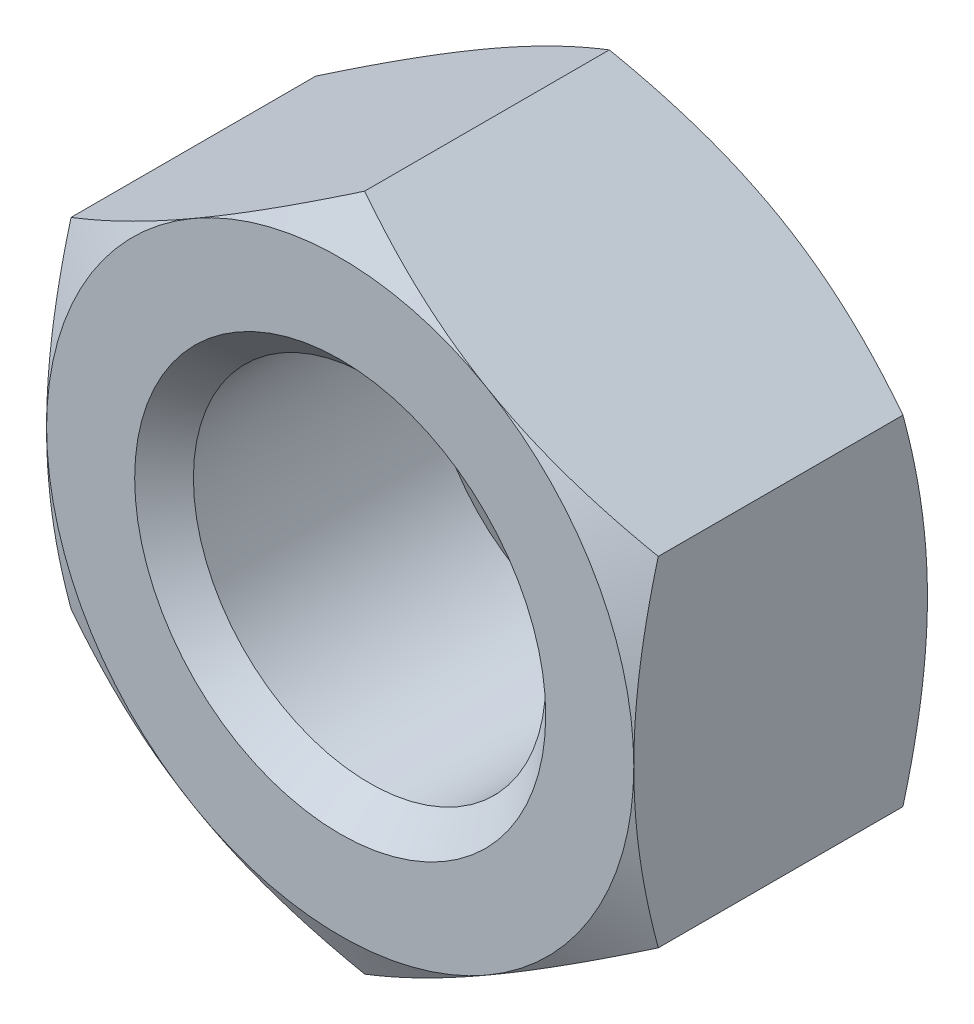
ISO-10303-21;
HEADER;
FILE_DESCRIPTION(('STEP AP214'),'2;1');
FILE_NAME('part.step','',(''),(''),'','','');
FILE_SCHEMA(('AUTOMOTIVE_DESIGN { 1 0 10303 214 1 1 1 1 }'));
ENDSEC;
DATA;
#1=APPLICATION_CONTEXT('core data for automotive mechanical design processes');
#2=APPLICATION_PROTOCOL_DEFINITION('international standard','automotive_design',2000,#1);
#3=PRODUCT_CONTEXT('',#1,'mechanical');
#4=PRODUCT('Part','Part','',(#3));
#5=PRODUCT_RELATED_PRODUCT_CATEGORY('part','',(#4));
#6=PRODUCT_DEFINITION_FORMATION('','',#4);
#7=PRODUCT_DEFINITION_CONTEXT('part definition',#1,'design');
#8=PRODUCT_DEFINITION('design','',#6,#7);
#9=PRODUCT_DEFINITION_SHAPE('','',#8);
#10=(LENGTH_UNIT() NAMED_UNIT(*) SI_UNIT(.MILLI.,.METRE.));
#11=(NAMED_UNIT(*) PLANE_ANGLE_UNIT() SI_UNIT($,.RADIAN.));
#12=(NAMED_UNIT(*) SI_UNIT($,.STERADIAN.) SOLID_ANGLE_UNIT());
#13=UNCERTAINTY_MEASURE_WITH_UNIT(LENGTH_MEASURE(1.E-05),#10,'distance_accuracy_value','');
#14=(GEOMETRIC_REPRESENTATION_CONTEXT(3) GLOBAL_UNCERTAINTY_ASSIGNED_CONTEXT((#13)) GLOBAL_UNIT_ASSIGNED_CONTEXT((#10,
#11,#12)) REPRESENTATION_CONTEXT('',''));
#15=CARTESIAN_POINT('',(0.,0.,0.));
#16=DIRECTION('',(0.,0.,1.));
#17=DIRECTION('',(1.,0.,0.));
#18=AXIS2_PLACEMENT_3D('',#15,#16,#17);
#19=CARTESIAN_POINT('',(0.,0.,5.));
#20=DIRECTION('',(0.,0.,1.));
#21=DIRECTION('',(1.,0.,0.));
#22=AXIS2_PLACEMENT_3D('',#19,#20,#21);
#23=PLANE('',#22);
#24=CARTESIAN_POINT('',(0.,0.,5.));
#25=DIRECTION('',(0.,0.,-1.));
#26=DIRECTION('',(-1.,0.,0.));
#27=AXIS2_PLACEMENT_3D('',#24,#25,#26);
#28=CIRCLE('',#27,3.5);
#29=CARTESIAN_POINT('',(-3.5,0.,5.));
#30=VERTEX_POINT('',#29);
#31=EDGE_CURVE('E160',#30,#30,#28,.T.);
#32=ORIENTED_EDGE('',*,*,#31,.T.);
#33=EDGE_LOOP('',(#32));
#34=FACE_BOUND('',#33,.T.);
#35=CARTESIAN_POINT('',(0.,0.,5.));
#36=DIRECTION('',(0.,0.,-1.));
#37=DIRECTION('',(-1.,0.,0.));
#38=AXIS2_PLACEMENT_3D('',#35,#36,#37);
#39=CIRCLE('',#38,5.);
#40=CARTESIAN_POINT('',(5.,0.,5.));
#41=VERTEX_POINT('',#40);
#42=CARTESIAN_POINT('',(2.5,-4.3301270189222,5.));
#43=VERTEX_POINT('',#42);
#44=EDGE_CURVE('E304',#41,#43,#39,.T.);
#45=ORIENTED_EDGE('',*,*,#44,.F.);
#46=CARTESIAN_POINT('',(2.5,4.33012701892219,5.));
#47=VERTEX_POINT('',#46);
#48=EDGE_CURVE('E306',#47,#41,#39,.T.);
#49=ORIENTED_EDGE('',*,*,#48,.F.);
#50=CARTESIAN_POINT('',(-2.5,4.33012701892219,5.));
#51=VERTEX_POINT('',#50);
#52=EDGE_CURVE('E312',#51,#47,#39,.T.);
#53=ORIENTED_EDGE('',*,*,#52,.F.);
#54=CARTESIAN_POINT('',(-5.,0.,5.));
#55=VERTEX_POINT('',#54);
#56=EDGE_CURVE('E314',#55,#51,#39,.T.);
#57=ORIENTED_EDGE('',*,*,#56,.F.);
#58=CARTESIAN_POINT('',(-2.5,-4.3301270189222,5.));
#59=VERTEX_POINT('',#58);
#60=EDGE_CURVE('E313',#59,#55,#39,.T.);
#61=ORIENTED_EDGE('',*,*,#60,.F.);
#62=EDGE_CURVE('E308',#43,#59,#39,.T.);
#63=ORIENTED_EDGE('',*,*,#62,.F.);
#64=EDGE_LOOP('',(#45,#49,#53,#57,#61,#63));
#65=FACE_BOUND('',#64,.T.);
#66=ADVANCED_FACE('F33',(#34,#65),#23,.T.);
#67=CARTESIAN_POINT('',(0.,0.,0.));
#68=DIRECTION('',(0.,0.,1.));
#69=DIRECTION('',(1.,0.,0.));
#70=AXIS2_PLACEMENT_3D('',#67,#68,#69);
#71=PLANE('',#70);
#72=CARTESIAN_POINT('',(0.,0.,0.));
#73=DIRECTION('',(0.,0.,-1.));
#74=DIRECTION('',(-1.,0.,0.));
#75=AXIS2_PLACEMENT_3D('',#72,#73,#74);
#76=CIRCLE('',#75,3.5);
#77=CARTESIAN_POINT('',(-3.5,0.,0.));
#78=VERTEX_POINT('',#77);
#79=EDGE_CURVE('E294',#78,#78,#76,.T.);
#80=ORIENTED_EDGE('',*,*,#79,.F.);
#81=EDGE_LOOP('',(#80));
#82=FACE_BOUND('',#81,.T.);
#83=CARTESIAN_POINT('',(0.,0.,0.));
#84=DIRECTION('',(0.,0.,-1.));
#85=DIRECTION('',(-1.,0.,0.));
#86=AXIS2_PLACEMENT_3D('',#83,#84,#85);
#87=CIRCLE('',#86,5.);
#88=CARTESIAN_POINT('',(2.5,4.33012701892219,0.));
#89=VERTEX_POINT('',#88);
#90=CARTESIAN_POINT('',(5.,0.,0.));
#91=VERTEX_POINT('',#90);
#92=EDGE_CURVE('E356',#89,#91,#87,.T.);
#93=ORIENTED_EDGE('',*,*,#92,.T.);
#94=CARTESIAN_POINT('',(2.5,-4.3301270189222,0.));
#95=VERTEX_POINT('',#94);
#96=EDGE_CURVE('E158',#91,#95,#87,.T.);
#97=ORIENTED_EDGE('',*,*,#96,.T.);
#98=CARTESIAN_POINT('',(-2.5,-4.33012701892219,0.));
#99=VERTEX_POINT('',#98);
#100=EDGE_CURVE('E156',#95,#99,#87,.T.);
#101=ORIENTED_EDGE('',*,*,#100,.T.);
#102=CARTESIAN_POINT('',(-5.,0.,0.));
#103=VERTEX_POINT('',#102);
#104=EDGE_CURVE('E54',#99,#103,#87,.T.);
#105=ORIENTED_EDGE('',*,*,#104,.T.);
#106=CARTESIAN_POINT('',(-2.5,4.33012701892219,0.));
#107=VERTEX_POINT('',#106);
#108=EDGE_CURVE('E130',#103,#107,#87,.T.);
#109=ORIENTED_EDGE('',*,*,#108,.T.);
#110=EDGE_CURVE('E137',#107,#89,#87,.T.);
#111=ORIENTED_EDGE('',*,*,#110,.T.);
#112=EDGE_LOOP('',(#93,#97,#101,#105,#109,#111));
#113=FACE_BOUND('',#112,.T.);
#114=ADVANCED_FACE('F154',(#82,#113),#71,.F.);
#115=CARTESIAN_POINT('',(-5.,-2.88675134594813,5.));
#116=DIRECTION('',(0.5,0.866025403784438,0.));
#117=DIRECTION('',(-0.866025403784439,0.5,0.));
#118=AXIS2_PLACEMENT_3D('',#115,#116,#117);
#119=PLANE('',#118);
#120=DIRECTION('',(0.,0.,-1.));
#121=VECTOR('',#120,1.);
#122=CARTESIAN_POINT('',(-5.,-2.88675134594813,5.));
#123=LINE('',#122,#121);
#124=CARTESIAN_POINT('',(-5.,-2.88675134594813,4.58333333333333));
#125=VERTEX_POINT('',#124);
#126=CARTESIAN_POINT('',(-5.,-2.88675134594813,0.416666666666667));
#127=VERTEX_POINT('',#126);
#128=EDGE_CURVE('E241',#125,#127,#123,.T.);
#129=ORIENTED_EDGE('',*,*,#128,.T.);
#130=CARTESIAN_POINT('',(-5.0002,-2.88663587589429,0.416728869379448));
#131=CARTESIAN_POINT('',(-4.78175516116707,-3.01275506239757,0.348765533577408));
#132=CARTESIAN_POINT('',(-4.56166924496526,-3.13982172536153,0.286997586736335));
#133=CARTESIAN_POINT('',(-4.11819817185179,-3.3958598688014,0.179130121938574));
#134=CARTESIAN_POINT('',(-3.89480722107393,-3.52483469436753,0.133062687666621));
#135=CARTESIAN_POINT('',(-3.45043111422823,-3.78139535927633,0.060961510014921));
#136=CARTESIAN_POINT('',(-3.22949756454779,-3.90895140365735,0.0345181652387445));
#137=CARTESIAN_POINT('',(-2.78669456792523,-4.16460383295536,0.00243911301740302));
#138=CARTESIAN_POINT('',(-2.56482631923197,-4.29269952606304,-0.00321799654368564));
#139=CARTESIAN_POINT('',(-2.14706061828178,-4.53389666596483,0.00617549854242377));
#140=CARTESIAN_POINT('',(-1.95112059003189,-4.64702269401993,0.0189119241848156));
#141=CARTESIAN_POINT('',(-1.56034378439473,-4.8726377879476,0.0600797793010292));
#142=CARTESIAN_POINT('',(-1.3655080125433,-4.98512627327379,0.0885237293315073));
#143=CARTESIAN_POINT('',(-0.973997607411936,-5.21116491106693,0.159936794716088));
#144=CARTESIAN_POINT('',(-0.777361253955197,-5.32469296266764,0.203178454477972));
#145=CARTESIAN_POINT('',(-0.386672761862441,-5.55025706874668,0.301598178146094));
#146=CARTESIAN_POINT('',(-0.192616813788899,-5.66229532260479,0.356755922559316));
#147=CARTESIAN_POINT('',(0.000199999999998629,-5.7736181619501,0.416728869379448));
#148=B_SPLINE_CURVE_WITH_KNOTS('',3,(#130,#131,#132,#133,#134,#135,#136,#137,#138,#139,#140,
#141,#142,#143,#144,#145,#146,#147),.UNSPECIFIED.,.F.,.F.,(4,2,2,2,2,2,2,2,4),(0.,
0.783954995805495,1.56950251520681,2.3381532908235,3.10601241898634,3.78526672149667,
4.46506324462742,5.15812185507093,5.85000785037024),.UNSPECIFIED.);
#149=EDGE_CURVE('E142',#127,#99,#148,.T.);
#150=ORIENTED_EDGE('',*,*,#149,.T.);
#151=CARTESIAN_POINT('',(0.,-5.77350269189626,0.416666666666667));
#152=VERTEX_POINT('',#151);
#153=EDGE_CURVE('E207',#99,#152,#148,.T.);
#154=ORIENTED_EDGE('',*,*,#153,.T.);
#155=DIRECTION('',(0.,0.,-1.));
#156=VECTOR('',#155,1.);
#157=CARTESIAN_POINT('',(0.,-5.77350269189626,5.));
#158=LINE('',#157,#156);
#159=CARTESIAN_POINT('',(0.,-5.77350269189626,4.58333333333333));
#160=VERTEX_POINT('',#159);
#161=EDGE_CURVE('E252',#160,#152,#158,.T.);
#162=ORIENTED_EDGE('',*,*,#161,.F.);
#163=CARTESIAN_POINT('',(0.000199999999998239,-5.7736181619501,4.58327113062055));
#164=CARTESIAN_POINT('',(-0.21824483883293,-5.64749897544682,4.65123446642259));
#165=CARTESIAN_POINT('',(-0.438330755034741,-5.52043231248286,4.71300241326367));
#166=CARTESIAN_POINT('',(-0.881801828148211,-5.26439416904298,4.82086987806143));
#167=CARTESIAN_POINT('',(-1.10519277892607,-5.13541934347686,4.86693731233338));
#168=CARTESIAN_POINT('',(-1.54956888577178,-4.87885867856806,4.93903848998508));
#169=CARTESIAN_POINT('',(-1.77050243545221,-4.75130263418704,4.96548183476126));
#170=CARTESIAN_POINT('',(-2.21330543207477,-4.49565020488903,4.9975608869826));
#171=CARTESIAN_POINT('',(-2.43517368076803,-4.36755451178134,5.00321799654369));
#172=CARTESIAN_POINT('',(-2.85293938171823,-4.12635737187956,4.99382450145758));
#173=CARTESIAN_POINT('',(-3.04887940996812,-4.01323134382446,4.98108807581518));
#174=CARTESIAN_POINT('',(-3.43965621560527,-3.78761624989678,4.93992022069897));
#175=CARTESIAN_POINT('',(-3.63449198745671,-3.67512776457059,4.91147627066849));
#176=CARTESIAN_POINT('',(-4.02600239258807,-3.44908912677746,4.84006320528391));
#177=CARTESIAN_POINT('',(-4.22263874604481,-3.33556107517675,4.79682154552203));
#178=CARTESIAN_POINT('',(-4.61332723813756,-3.1099969690977,4.69840182185391));
#179=CARTESIAN_POINT('',(-4.8073831862111,-2.9979587152396,4.64324407744068));
#180=CARTESIAN_POINT('',(-5.0002,-2.88663587589429,4.58327113062055));
#181=B_SPLINE_CURVE_WITH_KNOTS('',3,(#163,#164,#165,#166,#167,#168,#169,#170,#171,#172,#173,
#174,#175,#176,#177,#178,#179,#180),.UNSPECIFIED.,.F.,.F.,(4,2,2,2,2,2,2,2,4),(0.,
0.783954995805495,1.56950251520681,2.3381532908235,3.10601241898634,3.78526672149667,
4.46506324462742,5.15812185507093,5.85000785037024),.UNSPECIFIED.);
#182=EDGE_CURVE('E327',#160,#59,#181,.T.);
#183=ORIENTED_EDGE('',*,*,#182,.T.);
#184=EDGE_CURVE('E321',#59,#125,#181,.T.);
#185=ORIENTED_EDGE('',*,*,#184,.T.);
#186=EDGE_LOOP('',(#129,#150,#154,#162,#183,#185));
#187=FACE_BOUND('',#186,.T.);
#188=ADVANCED_FACE('F35',(#187),#119,.F.);
#189=CARTESIAN_POINT('',(0.,-5.77350269189626,5.));
#190=DIRECTION('',(-0.5,0.866025403784439,0.));
#191=DIRECTION('',(-0.866025403784439,-0.5,0.));
#192=AXIS2_PLACEMENT_3D('',#189,#190,#191);
#193=PLANE('',#192);
#194=ORIENTED_EDGE('',*,*,#161,.T.);
#195=CARTESIAN_POINT('',(-0.000200000000001806,-5.7736181619501,0.416728869379447));
#196=CARTESIAN_POINT('',(0.218244838832927,-5.64749897544682,0.348765533577408));
#197=CARTESIAN_POINT('',(0.438330755034738,-5.52043231248286,0.286997586736334));
#198=CARTESIAN_POINT('',(0.881801828148209,-5.26439416904298,0.179130121938574));
#199=CARTESIAN_POINT('',(1.10519277892607,-5.13541934347686,0.13306268766662));
#200=CARTESIAN_POINT('',(1.54956888577177,-4.87885867856806,0.0609615100149206));
#201=CARTESIAN_POINT('',(1.77050243545221,-4.75130263418704,0.0345181652387444));
#202=CARTESIAN_POINT('',(2.21330543207477,-4.49565020488903,0.00243911301740296));
#203=CARTESIAN_POINT('',(2.43517368076803,-4.36755451178134,-0.00321799654368583));
#204=CARTESIAN_POINT('',(2.85293938171822,-4.12635737187956,0.00617549854242346));
#205=CARTESIAN_POINT('',(3.04887940996811,-4.01323134382446,0.0189119241848153));
#206=CARTESIAN_POINT('',(3.43965621560527,-3.78761624989679,0.0600797793010289));
#207=CARTESIAN_POINT('',(3.6344919874567,-3.67512776457059,0.088523729331507));
#208=CARTESIAN_POINT('',(4.02600239258806,-3.44908912677746,0.159936794716088));
#209=CARTESIAN_POINT('',(4.2226387460448,-3.33556107517675,0.203178454477972));
#210=CARTESIAN_POINT('',(4.61332723813756,-3.10999696909771,0.301598178146093));
#211=CARTESIAN_POINT('',(4.8073831862111,-2.9979587152396,0.356755922559315));
#212=CARTESIAN_POINT('',(5.0002,-2.88663587589429,0.416728869379447));
#213=B_SPLINE_CURVE_WITH_KNOTS('',3,(#195,#196,#197,#198,#199,#200,#201,#202,#203,#204,#205,
#206,#207,#208,#209,#210,#211,#212),.UNSPECIFIED.,.F.,.F.,(4,2,2,2,2,2,2,2,4),(0.,
0.783954995805496,1.56950251520681,2.3381532908235,3.10601241898634,3.78526672149667,
4.46506324462742,5.15812185507093,5.85000785037024),.UNSPECIFIED.);
#214=EDGE_CURVE('E206',#152,#95,#213,.T.);
#215=ORIENTED_EDGE('',*,*,#214,.T.);
#216=CARTESIAN_POINT('',(5.,-2.88675134594813,0.416666666666667));
#217=VERTEX_POINT('',#216);
#218=EDGE_CURVE('E201',#95,#217,#213,.T.);
#219=ORIENTED_EDGE('',*,*,#218,.T.);
#220=DIRECTION('',(0.,0.,-1.));
#221=VECTOR('',#220,1.);
#222=CARTESIAN_POINT('',(5.,-2.88675134594813,5.));
#223=LINE('',#222,#221);
#224=CARTESIAN_POINT('',(5.,-2.88675134594813,4.58333333333333));
#225=VERTEX_POINT('',#224);
#226=EDGE_CURVE('E250',#225,#217,#223,.T.);
#227=ORIENTED_EDGE('',*,*,#226,.F.);
#228=CARTESIAN_POINT('',(5.0002,-2.88663587589429,4.58327113062055));
#229=CARTESIAN_POINT('',(4.78175516116707,-3.01275506239757,4.65123446642259));
#230=CARTESIAN_POINT('',(4.56166924496526,-3.13982172536153,4.71300241326367));
#231=CARTESIAN_POINT('',(4.11819817185179,-3.3958598688014,4.82086987806143));
#232=CARTESIAN_POINT('',(3.89480722107393,-3.52483469436753,4.86693731233338));
#233=CARTESIAN_POINT('',(3.45043111422822,-3.78139535927633,4.93903848998508));
#234=CARTESIAN_POINT('',(3.22949756454778,-3.90895140365735,4.96548183476126));
#235=CARTESIAN_POINT('',(2.78669456792523,-4.16460383295536,4.9975608869826));
#236=CARTESIAN_POINT('',(2.56482631923197,-4.29269952606305,5.00321799654369));
#237=CARTESIAN_POINT('',(2.14706061828177,-4.53389666596483,4.99382450145758));
#238=CARTESIAN_POINT('',(1.95112059003188,-4.64702269401993,4.98108807581518));
#239=CARTESIAN_POINT('',(1.56034378439473,-4.8726377879476,4.93992022069897));
#240=CARTESIAN_POINT('',(1.36550801254329,-4.9851262732738,4.91147627066849));
#241=CARTESIAN_POINT('',(0.973997607411932,-5.21116491106693,4.84006320528391));
#242=CARTESIAN_POINT('',(0.777361253955192,-5.32469296266764,4.79682154552203));
#243=CARTESIAN_POINT('',(0.386672761862438,-5.55025706874668,4.69840182185391));
#244=CARTESIAN_POINT('',(0.192616813788896,-5.66229532260479,4.64324407744068));
#245=CARTESIAN_POINT('',(-0.000200000000001396,-5.7736181619501,4.58327113062055));
#246=B_SPLINE_CURVE_WITH_KNOTS('',3,(#228,#229,#230,#231,#232,#233,#234,#235,#236,#237,#238,
#239,#240,#241,#242,#243,#244,#245),.UNSPECIFIED.,.F.,.F.,(4,2,2,2,2,2,2,2,4),(0.,
0.783954995805495,1.56950251520681,2.3381532908235,3.10601241898634,3.78526672149667,
4.46506324462742,5.15812185507093,5.85000785037024),.UNSPECIFIED.);
#247=EDGE_CURVE('E227',#225,#43,#246,.T.);
#248=ORIENTED_EDGE('',*,*,#247,.T.);
#249=EDGE_CURVE('E220',#43,#160,#246,.T.);
#250=ORIENTED_EDGE('',*,*,#249,.T.);
#251=EDGE_LOOP('',(#194,#215,#219,#227,#248,#250));
#252=FACE_BOUND('',#251,.T.);
#253=ADVANCED_FACE('F212',(#252),#193,.F.);
#254=CARTESIAN_POINT('',(5.,-2.88675134594813,5.));
#255=DIRECTION('',(-1.,0.,0.));
#256=DIRECTION('',(0.,0.,1.));
#257=AXIS2_PLACEMENT_3D('',#254,#255,#256);
#258=PLANE('',#257);
#259=ORIENTED_EDGE('',*,*,#226,.T.);
#260=CARTESIAN_POINT('',(5.,-7.65582007575141,2.2322357379369));
#261=CARTESIAN_POINT('',(5.,-7.43509090934645,2.13271344996753));
#262=CARTESIAN_POINT('',(5.,-7.21389297260311,2.03421202702547));
#263=CARTESIAN_POINT('',(5.,-6.77030857688186,1.83983032771715));
#264=CARTESIAN_POINT('',(5.,-6.54792193769698,1.74395046307467));
#265=CARTESIAN_POINT('',(5.,-6.10065180380134,1.55494687039546));
#266=CARTESIAN_POINT('',(5.,-5.87576137178877,1.46183950004295));
#267=CARTESIAN_POINT('',(5.,-5.42433025289516,1.27973082758423));
#268=CARTESIAN_POINT('',(5.,-5.19778964370641,1.19072933359692));
#269=CARTESIAN_POINT('',(5.,-4.74064850473281,1.01712332543199));
#270=CARTESIAN_POINT('',(5.,-4.51002979234615,0.93256643187063));
#271=CARTESIAN_POINT('',(5.,-4.04638940862333,0.77019361998909));
#272=CARTESIAN_POINT('',(5.,-3.81336751181826,0.692378340731449));
#273=CARTESIAN_POINT('',(5.,-3.34503478748528,0.545539153771843));
#274=CARTESIAN_POINT('',(5.,-3.10972921430672,0.476498651919743));
#275=CARTESIAN_POINT('',(5.,-2.63619226728798,0.349419348798464));
#276=CARTESIAN_POINT('',(5.,-2.39796170975541,0.291377549113839));
#277=CARTESIAN_POINT('',(5.,-1.9184520045743,0.189015906586139));
#278=CARTESIAN_POINT('',(5.,-1.67717199255605,0.144700049474874));
#279=CARTESIAN_POINT('',(5.,-1.19205215662433,0.0726459169911716));
#280=CARTESIAN_POINT('',(5.,-0.948212219359626,0.0449083788692652));
#281=CARTESIAN_POINT('',(5.,-0.582049611713462,0.0174073829128605));
#282=CARTESIAN_POINT('',(5.,-0.460230061857679,0.0105908559306879));
#283=CARTESIAN_POINT('',(5.,-0.216412293329393,0.0017265440480021));
#284=CARTESIAN_POINT('',(5.,-0.0944140759262677,-0.000321274569778221));
#285=CARTESIAN_POINT('',(5.,0.149530189707907,0.000403092957037886));
#286=CARTESIAN_POINT('',(5.,0.271476242502194,0.00317380930441669));
#287=CARTESIAN_POINT('',(5.,0.515167213056748,0.0134673083920565));
#288=CARTESIAN_POINT('',(5.,0.636912124662665,0.0209902339322519));
#289=CARTESIAN_POINT('',(5.,0.948432783832967,0.0461620472452999));
#290=CARTESIAN_POINT('',(5.,1.13794716480719,0.0671266775862859));
#291=CARTESIAN_POINT('',(5.,1.51558776634715,0.119294790996972));
#292=CARTESIAN_POINT('',(5.,1.70371356336517,0.150501275982321));
#293=CARTESIAN_POINT('',(5.,2.07843639734335,0.221904054587112));
#294=CARTESIAN_POINT('',(5.,2.26503163554253,0.262109688825432));
#295=CARTESIAN_POINT('',(5.,2.63637678054482,0.350147136652293));
#296=CARTESIAN_POINT('',(5.,2.82112686030062,0.397978228215802));
#297=CARTESIAN_POINT('',(5.,3.19312811793088,0.501201857037931));
#298=CARTESIAN_POINT('',(5.,3.3803373073649,0.556744578446767));
#299=CARTESIAN_POINT('',(5.,3.75288855437869,0.673288054283533));
#300=CARTESIAN_POINT('',(5.,3.93823187050556,0.734284811060842));
#301=CARTESIAN_POINT('',(5.,4.30625693379973,0.86040131208071));
#302=CARTESIAN_POINT('',(5.,4.48894798133233,0.925494085647232));
#303=CARTESIAN_POINT('',(5.,4.85305718570485,1.05940246305346));
#304=CARTESIAN_POINT('',(5.,5.03447472938578,1.12821973755675));
#305=CARTESIAN_POINT('',(5.,5.21530364145248,1.19850621244695));
#306=B_SPLINE_CURVE_WITH_KNOTS('',3,(#260,#261,#262,#263,#264,#265,#266,#267,#268,#269,#270,
#271,#272,#273,#274,#275,#276,#277,#278,#279,#280,#281,#282,#283,#284,#285,#286,#287,#288,#289,
#290,#291,#292,#293,#294,#295,#296,#297,#298,#299,#300,#301,#302,#303,#304,#305),.UNSPECIFIED.,
.F.,.F.,(4,2,2,2,2,2,2,2,2,2,2,2,2,2,2,2,2,2,2,2,2,2,4),(0.,0.72639347535826,1.45290038527038,
2.1830749881954,2.9132154330173,3.65002900655837,4.3869123491338,5.12238073903201,
5.85764833957271,6.59312924698762,7.32864285936809,7.69459399234744,8.06054253785265,
8.42637947768893,8.792227411144,9.36390651928135,9.93575333799857,10.508196477384,
11.0805854465018,11.6663078035028,12.2516043081311,12.8333845894716,13.4154280328702),.UNSPECIFIED.);
#307=EDGE_CURVE('E62',#217,#91,#306,.T.);
#308=ORIENTED_EDGE('',*,*,#307,.T.);
#309=CARTESIAN_POINT('',(5.,2.88675134594813,0.416666666666667));
#310=VERTEX_POINT('',#309);
#311=EDGE_CURVE('E195',#91,#310,#306,.T.);
#312=ORIENTED_EDGE('',*,*,#311,.T.);
#313=DIRECTION('',(0.,0.,-1.));
#314=VECTOR('',#313,1.);
#315=CARTESIAN_POINT('',(5.,2.88675134594813,5.));
#316=LINE('',#315,#314);
#317=CARTESIAN_POINT('',(5.,2.88675134594813,4.58333333333333));
#318=VERTEX_POINT('',#317);
#319=EDGE_CURVE('E247',#318,#310,#316,.T.);
#320=ORIENTED_EDGE('',*,*,#319,.F.);
#321=CARTESIAN_POINT('',(5.,-7.65582007575141,2.7677642620631));
#322=CARTESIAN_POINT('',(5.,-7.43509090934645,2.86728655003247));
#323=CARTESIAN_POINT('',(5.,-7.21389297260311,2.96578797297453));
#324=CARTESIAN_POINT('',(5.,-6.77030857688186,3.16016967228285));
#325=CARTESIAN_POINT('',(5.,-6.54792193769698,3.25604953692533));
#326=CARTESIAN_POINT('',(5.,-6.10065180380135,3.44505312960453));
#327=CARTESIAN_POINT('',(5.,-5.87576137178878,3.53816049995705));
#328=CARTESIAN_POINT('',(5.,-5.42433025289516,3.72026917241577));
#329=CARTESIAN_POINT('',(5.,-5.19778964370641,3.80927066640308));
#330=CARTESIAN_POINT('',(5.,-4.74064850473281,3.98287667456801));
#331=CARTESIAN_POINT('',(5.,-4.51002979234615,4.06743356812937));
#332=CARTESIAN_POINT('',(5.,-4.04638940862333,4.22980638001091));
#333=CARTESIAN_POINT('',(5.,-3.81336751181826,4.30762165926855));
#334=CARTESIAN_POINT('',(5.,-3.34503478748528,4.45446084622816));
#335=CARTESIAN_POINT('',(5.,-3.10972921430672,4.52350134808026));
#336=CARTESIAN_POINT('',(5.,-2.63619226728798,4.65058065120154));
#337=CARTESIAN_POINT('',(5.,-2.39796170975541,4.70862245088616));
#338=CARTESIAN_POINT('',(5.,-1.9184520045743,4.81098409341386));
#339=CARTESIAN_POINT('',(5.,-1.67717199255605,4.85529995052513));
#340=CARTESIAN_POINT('',(5.,-1.19205215662433,4.92735408300883));
#341=CARTESIAN_POINT('',(5.,-0.948212219359625,4.95509162113073));
#342=CARTESIAN_POINT('',(5.,-0.582049611713461,4.98259261708714));
#343=CARTESIAN_POINT('',(5.,-0.460230061857678,4.98940914406931));
#344=CARTESIAN_POINT('',(5.,-0.216412293329394,4.998273455952));
#345=CARTESIAN_POINT('',(5.,-0.0944140759262689,5.00032127456978));
#346=CARTESIAN_POINT('',(5.,0.149530189707905,4.99959690704296));
#347=CARTESIAN_POINT('',(5.,0.271476242502192,4.99682619069558));
#348=CARTESIAN_POINT('',(5.,0.515167213056747,4.98653269160794));
#349=CARTESIAN_POINT('',(5.,0.636912124662664,4.97900976606775));
#350=CARTESIAN_POINT('',(5.,0.948432783832966,4.9538379527547));
#351=CARTESIAN_POINT('',(5.,1.13794716480719,4.93287332241371));
#352=CARTESIAN_POINT('',(5.,1.51558776634714,4.88070520900303));
#353=CARTESIAN_POINT('',(5.,1.70371356336517,4.84949872401768));
#354=CARTESIAN_POINT('',(5.,2.07843639734334,4.77809594541289));
#355=CARTESIAN_POINT('',(5.,2.26503163554253,4.73789031117457));
#356=CARTESIAN_POINT('',(5.,2.63637678054482,4.64985286334771));
#357=CARTESIAN_POINT('',(5.,2.82112686030062,4.6020217717842));
#358=CARTESIAN_POINT('',(5.,3.19312811793088,4.49879814296207));
#359=CARTESIAN_POINT('',(5.,3.38033730736489,4.44325542155323));
#360=CARTESIAN_POINT('',(5.,3.75288855437868,4.32671194571647));
#361=CARTESIAN_POINT('',(5.,3.93823187050556,4.26571518893916));
#362=CARTESIAN_POINT('',(5.,4.30625693379972,4.13959868791929));
#363=CARTESIAN_POINT('',(5.,4.48894798133233,4.07450591435277));
#364=CARTESIAN_POINT('',(5.,4.85305718570485,3.94059753694654));
#365=CARTESIAN_POINT('',(5.,5.03447472938577,3.87178026244325));
#366=CARTESIAN_POINT('',(5.,5.21530364145248,3.80149378755305));
#367=B_SPLINE_CURVE_WITH_KNOTS('',3,(#321,#322,#323,#324,#325,#326,#327,#328,#329,#330,#331,
#332,#333,#334,#335,#336,#337,#338,#339,#340,#341,#342,#343,#344,#345,#346,#347,#348,#349,#350,
#351,#352,#353,#354,#355,#356,#357,#358,#359,#360,#361,#362,#363,#364,#365,#366),.UNSPECIFIED.,
.F.,.F.,(4,2,2,2,2,2,2,2,2,2,2,2,2,2,2,2,2,2,2,2,2,2,4),(0.,0.726393475358261,1.45290038527038,
2.18307498819539,2.9132154330173,3.65002900655836,4.38691234913379,5.12238073903201,
5.85764833957271,6.59312924698762,7.32864285936809,7.69459399234744,8.06054253785265,
8.42637947768893,8.792227411144,9.36390651928135,9.93575333799857,10.508196477384,
11.0805854465018,11.6663078035028,12.2516043081311,12.8333845894716,13.4154280328702),.UNSPECIFIED.);
#368=EDGE_CURVE('E239',#318,#41,#367,.F.);
#369=ORIENTED_EDGE('',*,*,#368,.T.);
#370=EDGE_CURVE('E233',#41,#225,#367,.F.);
#371=ORIENTED_EDGE('',*,*,#370,.T.);
#372=EDGE_LOOP('',(#259,#308,#312,#320,#369,#371));
#373=FACE_BOUND('',#372,.T.);
#374=ADVANCED_FACE('F215',(#373),#258,.F.);
#375=CARTESIAN_POINT('',(5.,2.88675134594813,5.));
#376=DIRECTION('',(-0.5,-0.866025403784439,0.));
#377=DIRECTION('',(0.866025403784439,-0.5,0.));
#378=AXIS2_PLACEMENT_3D('',#375,#376,#377);
#379=PLANE('',#378);
#380=ORIENTED_EDGE('',*,*,#319,.T.);
#381=CARTESIAN_POINT('',(5.0002,2.88663587589429,0.416728869379447));
#382=CARTESIAN_POINT('',(4.78175516116707,3.01275506239757,0.348765533577407));
#383=CARTESIAN_POINT('',(4.56166924496526,3.13982172536153,0.286997586736334));
#384=CARTESIAN_POINT('',(4.11819817185179,3.3958598688014,0.179130121938573));
#385=CARTESIAN_POINT('',(3.89480722107393,3.52483469436753,0.13306268766662));
#386=CARTESIAN_POINT('',(3.45043111422822,3.78139535927633,0.0609615100149202));
#387=CARTESIAN_POINT('',(3.22949756454779,3.90895140365735,0.0345181652387441));
#388=CARTESIAN_POINT('',(2.78669456792523,4.16460383295536,0.0024391130174029));
#389=CARTESIAN_POINT('',(2.56482631923197,4.29269952606304,-0.0032179965436859));
#390=CARTESIAN_POINT('',(2.14706061828177,4.53389666596483,0.00617549854242346));
#391=CARTESIAN_POINT('',(1.95112059003188,4.64702269401993,0.0189119241848154));
#392=CARTESIAN_POINT('',(1.56034378439473,4.8726377879476,0.0600797793010288));
#393=CARTESIAN_POINT('',(1.36550801254329,4.9851262732738,0.0885237293315067));
#394=CARTESIAN_POINT('',(0.973997607411933,5.21116491106693,0.159936794716088));
#395=CARTESIAN_POINT('',(0.777361253955194,5.32469296266764,0.203178454477971));
#396=CARTESIAN_POINT('',(0.386672761862439,5.55025706874668,0.301598178146093));
#397=CARTESIAN_POINT('',(0.192616813788897,5.66229532260479,0.356755922559316));
#398=CARTESIAN_POINT('',(-0.000200000000000343,5.7736181619501,0.416728869379447));
#399=B_SPLINE_CURVE_WITH_KNOTS('',3,(#381,#382,#383,#384,#385,#386,#387,#388,#389,#390,#391,
#392,#393,#394,#395,#396,#397,#398),.UNSPECIFIED.,.F.,.F.,(4,2,2,2,2,2,2,2,4),(0.,
0.783954995805495,1.56950251520681,2.3381532908235,3.10601241898634,3.78526672149667,
4.46506324462742,5.15812185507093,5.85000785037024),.UNSPECIFIED.);
#400=EDGE_CURVE('E363',#310,#89,#399,.T.);
#401=ORIENTED_EDGE('',*,*,#400,.T.);
#402=CARTESIAN_POINT('',(0.,5.77350269189626,0.416666666666667));
#403=VERTEX_POINT('',#402);
#404=EDGE_CURVE('E170',#89,#403,#399,.T.);
#405=ORIENTED_EDGE('',*,*,#404,.T.);
#406=DIRECTION('',(0.,0.,-1.));
#407=VECTOR('',#406,1.);
#408=CARTESIAN_POINT('',(0.,5.77350269189626,5.));
#409=LINE('',#408,#407);
#410=CARTESIAN_POINT('',(0.,5.77350269189626,4.58333333333333));
#411=VERTEX_POINT('',#410);
#412=EDGE_CURVE('E244',#411,#403,#409,.T.);
#413=ORIENTED_EDGE('',*,*,#412,.F.);
#414=CARTESIAN_POINT('',(-0.000199999999999962,5.77361816195009,4.58327113062055));
#415=CARTESIAN_POINT('',(0.218244838832929,5.64749897544682,4.65123446642259));
#416=CARTESIAN_POINT('',(0.43833075503474,5.52043231248286,4.71300241326367));
#417=CARTESIAN_POINT('',(0.88180182814821,5.26439416904298,4.82086987806143));
#418=CARTESIAN_POINT('',(1.10519277892607,5.13541934347686,4.86693731233338));
#419=CARTESIAN_POINT('',(1.54956888577177,4.87885867856806,4.93903848998508));
#420=CARTESIAN_POINT('',(1.77050243545221,4.75130263418703,4.96548183476126));
#421=CARTESIAN_POINT('',(2.21330543207477,4.49565020488903,4.9975608869826));
#422=CARTESIAN_POINT('',(2.43517368076803,4.36755451178134,5.00321799654369));
#423=CARTESIAN_POINT('',(2.85293938171822,4.12635737187956,4.99382450145758));
#424=CARTESIAN_POINT('',(3.04887940996811,4.01323134382446,4.98108807581519));
#425=CARTESIAN_POINT('',(3.43965621560527,3.78761624989679,4.93992022069897));
#426=CARTESIAN_POINT('',(3.6344919874567,3.67512776457059,4.91147627066849));
#427=CARTESIAN_POINT('',(4.02600239258806,3.44908912677746,4.84006320528391));
#428=CARTESIAN_POINT('',(4.2226387460448,3.33556107517675,4.79682154552203));
#429=CARTESIAN_POINT('',(4.61332723813756,3.1099969690977,4.69840182185391));
#430=CARTESIAN_POINT('',(4.8073831862111,2.9979587152396,4.64324407744069));
#431=CARTESIAN_POINT('',(5.0002,2.88663587589429,4.58327113062055));
#432=B_SPLINE_CURVE_WITH_KNOTS('',3,(#414,#415,#416,#417,#418,#419,#420,#421,#422,#423,#424,
#425,#426,#427,#428,#429,#430,#431),.UNSPECIFIED.,.F.,.F.,(4,2,2,2,2,2,2,2,4),(0.,
0.783954995805495,1.56950251520681,2.3381532908235,3.10601241898634,3.78526672149667,
4.46506324462742,5.15812185507093,5.85000785037024),.UNSPECIFIED.);
#433=EDGE_CURVE('E228',#411,#47,#432,.T.);
#434=ORIENTED_EDGE('',*,*,#433,.T.);
#435=EDGE_CURVE('E240',#47,#318,#432,.T.);
#436=ORIENTED_EDGE('',*,*,#435,.T.);
#437=EDGE_LOOP('',(#380,#401,#405,#413,#434,#436));
#438=FACE_BOUND('',#437,.T.);
#439=ADVANCED_FACE('F364',(#438),#379,.F.);
#440=CARTESIAN_POINT('',(0.,5.77350269189626,5.));
#441=DIRECTION('',(0.5,-0.866025403784439,0.));
#442=DIRECTION('',(0.866025403784439,0.5,0.));
#443=AXIS2_PLACEMENT_3D('',#440,#441,#442);
#444=PLANE('',#443);
#445=ORIENTED_EDGE('',*,*,#412,.T.);
#446=CARTESIAN_POINT('',(0.000200000000000083,5.7736181619501,0.416728869379447));
#447=CARTESIAN_POINT('',(-0.218244838832929,5.64749897544682,0.348765533577408));
#448=CARTESIAN_POINT('',(-0.43833075503474,5.52043231248286,0.286997586736335));
#449=CARTESIAN_POINT('',(-0.88180182814821,5.26439416904299,0.179130121938574));
#450=CARTESIAN_POINT('',(-1.10519277892607,5.13541934347686,0.13306268766662));
#451=CARTESIAN_POINT('',(-1.54956888577177,4.87885867856806,0.0609615100149206));
#452=CARTESIAN_POINT('',(-1.77050243545221,4.75130263418703,0.0345181652387445));
#453=CARTESIAN_POINT('',(-2.21330543207477,4.49565020488903,0.00243911301740345));
#454=CARTESIAN_POINT('',(-2.43517368076803,4.36755451178134,-0.00321799654368533));
#455=CARTESIAN_POINT('',(-2.85293938171822,4.12635737187956,0.00617549854242396));
#456=CARTESIAN_POINT('',(-3.04887940996811,4.01323134382446,0.0189119241848157));
#457=CARTESIAN_POINT('',(-3.43965621560527,3.78761624989679,0.0600797793010293));
#458=CARTESIAN_POINT('',(-3.6344919874567,3.67512776457059,0.0885237293315075));
#459=CARTESIAN_POINT('',(-4.02600239258807,3.44908912677746,0.159936794716089));
#460=CARTESIAN_POINT('',(-4.2226387460448,3.33556107517675,0.203178454477972));
#461=CARTESIAN_POINT('',(-4.61332723813756,3.10999696909771,0.301598178146094));
#462=CARTESIAN_POINT('',(-4.8073831862111,2.9979587152396,0.356755922559316));
#463=CARTESIAN_POINT('',(-5.0002,2.88663587589429,0.416728869379448));
#464=B_SPLINE_CURVE_WITH_KNOTS('',3,(#446,#447,#448,#449,#450,#451,#452,#453,#454,#455,#456,
#457,#458,#459,#460,#461,#462,#463),.UNSPECIFIED.,.F.,.F.,(4,2,2,2,2,2,2,2,4),(0.,
0.783954995805495,1.56950251520681,2.3381532908235,3.10601241898634,3.78526672149667,
4.46506324462742,5.15812185507093,5.85000785037024),.UNSPECIFIED.);
#465=EDGE_CURVE('E169',#403,#107,#464,.T.);
#466=ORIENTED_EDGE('',*,*,#465,.T.);
#467=CARTESIAN_POINT('',(-5.,2.88675134594813,0.416666666666667));
#468=VERTEX_POINT('',#467);
#469=EDGE_CURVE('E133',#107,#468,#464,.T.);
#470=ORIENTED_EDGE('',*,*,#469,.T.);
#471=DIRECTION('',(0.,0.,-1.));
#472=VECTOR('',#471,1.);
#473=CARTESIAN_POINT('',(-5.,2.88675134594813,5.));
#474=LINE('',#473,#472);
#475=CARTESIAN_POINT('',(-5.,2.88675134594813,4.58333333333333));
#476=VERTEX_POINT('',#475);
#477=EDGE_CURVE('E151',#476,#468,#474,.T.);
#478=ORIENTED_EDGE('',*,*,#477,.F.);
#479=CARTESIAN_POINT('',(-5.0002,2.88663587589429,4.58327113062055));
#480=CARTESIAN_POINT('',(-4.78175516116707,3.01275506239757,4.65123446642259));
#481=CARTESIAN_POINT('',(-4.56166924496526,3.13982172536153,4.71300241326366));
#482=CARTESIAN_POINT('',(-4.11819817185179,3.3958598688014,4.82086987806143));
#483=CARTESIAN_POINT('',(-3.89480722107393,3.52483469436753,4.86693731233338));
#484=CARTESIAN_POINT('',(-3.45043111422823,3.78139535927633,4.93903848998508));
#485=CARTESIAN_POINT('',(-3.22949756454779,3.90895140365735,4.96548183476126));
#486=CARTESIAN_POINT('',(-2.78669456792523,4.16460383295536,4.9975608869826));
#487=CARTESIAN_POINT('',(-2.56482631923197,4.29269952606305,5.00321799654369));
#488=CARTESIAN_POINT('',(-2.14706061828178,4.53389666596483,4.99382450145758));
#489=CARTESIAN_POINT('',(-1.95112059003189,4.64702269401993,4.98108807581518));
#490=CARTESIAN_POINT('',(-1.56034378439473,4.8726377879476,4.93992022069897));
#491=CARTESIAN_POINT('',(-1.3655080125433,4.9851262732738,4.91147627066849));
#492=CARTESIAN_POINT('',(-0.973997607411934,5.21116491106693,4.84006320528391));
#493=CARTESIAN_POINT('',(-0.777361253955195,5.32469296266764,4.79682154552203));
#494=CARTESIAN_POINT('',(-0.38667276186244,5.55025706874668,4.69840182185391));
#495=CARTESIAN_POINT('',(-0.192616813788897,5.66229532260479,4.64324407744068));
#496=CARTESIAN_POINT('',(0.000199999999999701,5.7736181619501,4.58327113062055));
#497=B_SPLINE_CURVE_WITH_KNOTS('',3,(#479,#480,#481,#482,#483,#484,#485,#486,#487,#488,#489,
#490,#491,#492,#493,#494,#495,#496),.UNSPECIFIED.,.F.,.F.,(4,2,2,2,2,2,2,2,4),(0.,
0.783954995805495,1.56950251520681,2.3381532908235,3.10601241898634,3.78526672149667,
4.46506324462742,5.15812185507093,5.85000785037024),.UNSPECIFIED.);
#498=EDGE_CURVE('E316',#476,#51,#497,.T.);
#499=ORIENTED_EDGE('',*,*,#498,.T.);
#500=EDGE_CURVE('E322',#51,#411,#497,.T.);
#501=ORIENTED_EDGE('',*,*,#500,.T.);
#502=EDGE_LOOP('',(#445,#466,#470,#478,#499,#501));
#503=FACE_BOUND('',#502,.T.);
#504=ADVANCED_FACE('F176',(#503),#444,.F.);
#505=CARTESIAN_POINT('',(-5.,2.88675134594813,5.));
#506=DIRECTION('',(1.,0.,0.));
#507=DIRECTION('',(0.,0.,-1.));
#508=AXIS2_PLACEMENT_3D('',#505,#506,#507);
#509=PLANE('',#508);
#510=ORIENTED_EDGE('',*,*,#477,.T.);
#511=CARTESIAN_POINT('',(-5.,-7.65582007575141,2.2322357379369));
#512=CARTESIAN_POINT('',(-5.,-7.43509090934645,2.13271344996753));
#513=CARTESIAN_POINT('',(-5.,-7.21389297260311,2.03421202702547));
#514=CARTESIAN_POINT('',(-5.,-6.77030857688186,1.83983032771715));
#515=CARTESIAN_POINT('',(-5.,-6.54792193769698,1.74395046307467));
#516=CARTESIAN_POINT('',(-5.,-6.10065180380135,1.55494687039547));
#517=CARTESIAN_POINT('',(-5.,-5.87576137178878,1.46183950004295));
#518=CARTESIAN_POINT('',(-5.,-5.42433025289516,1.27973082758423));
#519=CARTESIAN_POINT('',(-5.,-5.19778964370641,1.19072933359692));
#520=CARTESIAN_POINT('',(-5.,-4.74064850473281,1.01712332543199));
#521=CARTESIAN_POINT('',(-5.,-4.51002979234614,0.932566431870631));
#522=CARTESIAN_POINT('',(-5.,-4.04638940862333,0.77019361998909));
#523=CARTESIAN_POINT('',(-5.,-3.81336751181826,0.692378340731449));
#524=CARTESIAN_POINT('',(-5.,-3.34503478748527,0.545539153771844));
#525=CARTESIAN_POINT('',(-5.,-3.10972921430671,0.476498651919744));
#526=CARTESIAN_POINT('',(-5.,-2.63619226728798,0.349419348798465));
#527=CARTESIAN_POINT('',(-5.,-2.3979617097554,0.29137754911384));
#528=CARTESIAN_POINT('',(-5.,-1.9184520045743,0.189015906586139));
#529=CARTESIAN_POINT('',(-5.,-1.67717199255605,0.144700049474874));
#530=CARTESIAN_POINT('',(-5.,-1.19205215662432,0.0726459169911723));
#531=CARTESIAN_POINT('',(-5.,-0.948212219359622,0.0449083788692659));
#532=CARTESIAN_POINT('',(-5.,-0.582049611713458,0.0174073829128616));
#533=CARTESIAN_POINT('',(-5.,-0.460230061857675,0.0105908559306892));
#534=CARTESIAN_POINT('',(-5.,-0.21641229332939,0.00172654404800359));
#535=CARTESIAN_POINT('',(-5.,-0.0944140759262649,-0.000321274569776733));
#536=CARTESIAN_POINT('',(-5.,0.149530189707909,0.000403092957039306));
#537=CARTESIAN_POINT('',(-5.,0.271476242502196,0.00317380930441804));
#538=CARTESIAN_POINT('',(-5.,0.515167213056751,0.013467308392058));
#539=CARTESIAN_POINT('',(-5.,0.636912124662668,0.0209902339322536));
#540=CARTESIAN_POINT('',(-5.,0.948432783832971,0.0461620472453019));
#541=CARTESIAN_POINT('',(-5.,1.1379471648072,0.067126677586288));
#542=CARTESIAN_POINT('',(-5.,1.51558776634715,0.119294790996975));
#543=CARTESIAN_POINT('',(-5.,1.70371356336518,0.150501275982323));
#544=CARTESIAN_POINT('',(-5.,2.07843639734335,0.221904054587114));
#545=CARTESIAN_POINT('',(-5.,2.26503163554253,0.262109688825434));
#546=CARTESIAN_POINT('',(-5.,2.63637678054482,0.350147136652295));
#547=CARTESIAN_POINT('',(-5.,2.82112686030062,0.397978228215805));
#548=CARTESIAN_POINT('',(-5.,3.19312811793089,0.501201857037934));
#549=CARTESIAN_POINT('',(-5.,3.38033730736491,0.55674457844677));
#550=CARTESIAN_POINT('',(-5.,3.75288855437869,0.673288054283537));
#551=CARTESIAN_POINT('',(-5.,3.93823187050557,0.734284811060846));
#552=CARTESIAN_POINT('',(-5.,4.30625693379973,0.860401312080714));
#553=CARTESIAN_POINT('',(-5.,4.48894798133234,0.925494085647236));
#554=CARTESIAN_POINT('',(-5.,4.85305718570486,1.05940246305347));
#555=CARTESIAN_POINT('',(-5.,5.03447472938579,1.12821973755675));
#556=CARTESIAN_POINT('',(-5.,5.21530364145249,1.19850621244695));
#557=B_SPLINE_CURVE_WITH_KNOTS('',3,(#511,#512,#513,#514,#515,#516,#517,#518,#519,#520,#521,
#522,#523,#524,#525,#526,#527,#528,#529,#530,#531,#532,#533,#534,#535,#536,#537,#538,#539,#540,
#541,#542,#543,#544,#545,#546,#547,#548,#549,#550,#551,#552,#553,#554,#555,#556),.UNSPECIFIED.,
.F.,.F.,(4,2,2,2,2,2,2,2,2,2,2,2,2,2,2,2,2,2,2,2,2,2,4),(0.,0.726393475358261,1.45290038527038,
2.18307498819539,2.9132154330173,3.65002900655837,4.3869123491338,5.12238073903202,
5.85764833957271,6.59312924698762,7.32864285936809,7.69459399234744,8.06054253785266,
8.42637947768894,8.792227411144,9.36390651928135,9.93575333799858,10.508196477384,
11.0805854465018,11.6663078035028,12.2516043081311,12.8333845894716,13.4154280328703),.UNSPECIFIED.);
#558=EDGE_CURVE('E11',#468,#103,#557,.F.);
#559=ORIENTED_EDGE('',*,*,#558,.T.);
#560=EDGE_CURVE('E38',#103,#127,#557,.F.);
#561=ORIENTED_EDGE('',*,*,#560,.T.);
#562=ORIENTED_EDGE('',*,*,#128,.F.);
#563=CARTESIAN_POINT('',(-5.,-7.65582007575141,2.7677642620631));
#564=CARTESIAN_POINT('',(-5.,-7.43509090934645,2.86728655003247));
#565=CARTESIAN_POINT('',(-5.,-7.21389297260311,2.96578797297453));
#566=CARTESIAN_POINT('',(-5.,-6.77030857688186,3.16016967228284));
#567=CARTESIAN_POINT('',(-5.,-6.54792193769697,3.25604953692533));
#568=CARTESIAN_POINT('',(-5.,-6.10065180380134,3.44505312960453));
#569=CARTESIAN_POINT('',(-5.,-5.87576137178877,3.53816049995705));
#570=CARTESIAN_POINT('',(-5.,-5.42433025289516,3.72026917241577));
#571=CARTESIAN_POINT('',(-5.,-5.19778964370641,3.80927066640308));
#572=CARTESIAN_POINT('',(-5.,-4.74064850473281,3.98287667456801));
#573=CARTESIAN_POINT('',(-5.,-4.51002979234615,4.06743356812937));
#574=CARTESIAN_POINT('',(-5.,-4.04638940862333,4.22980638001091));
#575=CARTESIAN_POINT('',(-5.,-3.81336751181826,4.30762165926855));
#576=CARTESIAN_POINT('',(-5.,-3.34503478748527,4.45446084622816));
#577=CARTESIAN_POINT('',(-5.,-3.10972921430672,4.52350134808026));
#578=CARTESIAN_POINT('',(-5.,-2.63619226728798,4.65058065120154));
#579=CARTESIAN_POINT('',(-5.,-2.39796170975541,4.70862245088616));
#580=CARTESIAN_POINT('',(-5.,-1.9184520045743,4.81098409341386));
#581=CARTESIAN_POINT('',(-5.,-1.67717199255605,4.85529995052513));
#582=CARTESIAN_POINT('',(-5.,-1.19205215662433,4.92735408300883));
#583=CARTESIAN_POINT('',(-5.,-0.948212219359623,4.95509162113073));
#584=CARTESIAN_POINT('',(-5.,-0.582049611713458,4.98259261708714));
#585=CARTESIAN_POINT('',(-5.,-0.460230061857675,4.98940914406931));
#586=CARTESIAN_POINT('',(-5.,-0.21641229332939,4.998273455952));
#587=CARTESIAN_POINT('',(-5.,-0.0944140759262643,5.00032127456978));
#588=CARTESIAN_POINT('',(-5.,0.14953018970791,4.99959690704296));
#589=CARTESIAN_POINT('',(-5.,0.271476242502196,4.99682619069558));
#590=CARTESIAN_POINT('',(-5.,0.515167213056751,4.98653269160794));
#591=CARTESIAN_POINT('',(-5.,0.636912124662668,4.97900976606775));
#592=CARTESIAN_POINT('',(-5.,0.948432783832971,4.9538379527547));
#593=CARTESIAN_POINT('',(-5.,1.1379471648072,4.93287332241371));
#594=CARTESIAN_POINT('',(-5.,1.51558776634715,4.88070520900302));
#595=CARTESIAN_POINT('',(-5.,1.70371356336518,4.84949872401768));
#596=CARTESIAN_POINT('',(-5.,2.07843639734335,4.77809594541289));
#597=CARTESIAN_POINT('',(-5.,2.26503163554254,4.73789031117457));
#598=CARTESIAN_POINT('',(-5.,2.63637678054482,4.64985286334771));
#599=CARTESIAN_POINT('',(-5.,2.82112686030062,4.6020217717842));
#600=CARTESIAN_POINT('',(-5.,3.19312811793089,4.49879814296207));
#601=CARTESIAN_POINT('',(-5.,3.3803373073649,4.44325542155323));
#602=CARTESIAN_POINT('',(-5.,3.75288855437869,4.32671194571646));
#603=CARTESIAN_POINT('',(-5.,3.93823187050557,4.26571518893915));
#604=CARTESIAN_POINT('',(-5.,4.30625693379973,4.13959868791929));
#605=CARTESIAN_POINT('',(-5.,4.48894798133234,4.07450591435276));
#606=CARTESIAN_POINT('',(-5.,4.85305718570486,3.94059753694654));
#607=CARTESIAN_POINT('',(-5.,5.03447472938578,3.87178026244325));
#608=CARTESIAN_POINT('',(-5.,5.21530364145249,3.80149378755305));
#609=B_SPLINE_CURVE_WITH_KNOTS('',3,(#563,#564,#565,#566,#567,#568,#569,#570,#571,#572,#573,
#574,#575,#576,#577,#578,#579,#580,#581,#582,#583,#584,#585,#586,#587,#588,#589,#590,#591,#592,
#593,#594,#595,#596,#597,#598,#599,#600,#601,#602,#603,#604,#605,#606,#607,#608),.UNSPECIFIED.,
.F.,.F.,(4,2,2,2,2,2,2,2,2,2,2,2,2,2,2,2,2,2,2,2,2,2,4),(0.,0.726393475358261,1.45290038527038,
2.18307498819539,2.9132154330173,3.65002900655837,4.3869123491338,5.12238073903201,
5.85764833957271,6.59312924698762,7.32864285936809,7.69459399234744,8.06054253785266,
8.42637947768894,8.792227411144,9.36390651928135,9.93575333799858,10.508196477384,
11.0805854465018,11.6663078035028,12.2516043081311,12.8333845894716,13.4154280328703),.UNSPECIFIED.);
#610=EDGE_CURVE('E146',#125,#55,#609,.T.);
#611=ORIENTED_EDGE('',*,*,#610,.T.);
#612=EDGE_CURVE('E254',#55,#476,#609,.T.);
#613=ORIENTED_EDGE('',*,*,#612,.T.);
#614=EDGE_LOOP('',(#510,#559,#561,#562,#611,#613));
#615=FACE_BOUND('',#614,.T.);
#616=ADVANCED_FACE('F148',(#615),#509,.F.);
#617=CARTESIAN_POINT('',(0.,0.,5.));
#618=DIRECTION('',(0.,0.,-1.));
#619=DIRECTION('',(-1.,0.,0.));
#620=AXIS2_PLACEMENT_3D('',#617,#618,#619);
#621=CYLINDRICAL_SURFACE('',#620,3.);
#622=CARTESIAN_POINT('',(0.,0.,0.5));
#623=DIRECTION('',(0.,0.,-1.));
#624=DIRECTION('',(-1.,0.,0.));
#625=AXIS2_PLACEMENT_3D('',#622,#623,#624);
#626=CIRCLE('',#625,3.);
#627=CARTESIAN_POINT('',(-3.,0.,0.5));
#628=VERTEX_POINT('',#627);
#629=EDGE_CURVE('E279',#628,#628,#626,.T.);
#630=ORIENTED_EDGE('',*,*,#629,.T.);
#631=EDGE_LOOP('',(#630));
#632=FACE_BOUND('',#631,.T.);
#633=CARTESIAN_POINT('',(0.,0.,4.5));
#634=DIRECTION('',(0.,0.,-1.));
#635=DIRECTION('',(-1.,0.,0.));
#636=AXIS2_PLACEMENT_3D('',#633,#634,#635);
#637=CIRCLE('',#636,3.);
#638=CARTESIAN_POINT('',(-3.,0.,4.5));
#639=VERTEX_POINT('',#638);
#640=EDGE_CURVE('E157',#639,#639,#637,.T.);
#641=ORIENTED_EDGE('',*,*,#640,.F.);
#642=EDGE_LOOP('',(#641));
#643=FACE_BOUND('',#642,.T.);
#644=ADVANCED_FACE('F261',(#632,#643),#621,.F.);
#645=CARTESIAN_POINT('',(0.,0.,5.));
#646=DIRECTION('',(0.,0.,-1.));
#647=DIRECTION('',(-1.,0.,0.));
#648=AXIS2_PLACEMENT_3D('',#645,#646,#647);
#649=CONICAL_SURFACE('',#648,5.,1.07668938664621);
#650=ORIENTED_EDGE('',*,*,#612,.F.);
#651=ORIENTED_EDGE('',*,*,#56,.T.);
#652=ORIENTED_EDGE('',*,*,#498,.F.);
#653=EDGE_LOOP('',(#650,#651,#652));
#654=FACE_BOUND('',#653,.T.);
#655=ADVANCED_FACE('F269',(#654),#649,.T.);
#656=ORIENTED_EDGE('',*,*,#60,.T.);
#657=ORIENTED_EDGE('',*,*,#610,.F.);
#658=ORIENTED_EDGE('',*,*,#184,.F.);
#659=EDGE_LOOP('',(#656,#657,#658));
#660=FACE_BOUND('',#659,.T.);
#661=ADVANCED_FACE('F274',(#660),#649,.T.);
#662=ORIENTED_EDGE('',*,*,#500,.F.);
#663=ORIENTED_EDGE('',*,*,#52,.T.);
#664=ORIENTED_EDGE('',*,*,#433,.F.);
#665=EDGE_LOOP('',(#662,#663,#664));
#666=FACE_BOUND('',#665,.T.);
#667=ADVANCED_FACE('F347',(#666),#649,.T.);
#668=ORIENTED_EDGE('',*,*,#435,.F.);
#669=ORIENTED_EDGE('',*,*,#48,.T.);
#670=ORIENTED_EDGE('',*,*,#368,.F.);
#671=EDGE_LOOP('',(#668,#669,#670));
#672=FACE_BOUND('',#671,.T.);
#673=ADVANCED_FACE('F186',(#672),#649,.T.);
#674=ORIENTED_EDGE('',*,*,#44,.T.);
#675=ORIENTED_EDGE('',*,*,#247,.F.);
#676=ORIENTED_EDGE('',*,*,#370,.F.);
#677=EDGE_LOOP('',(#674,#675,#676));
#678=FACE_BOUND('',#677,.T.);
#679=ADVANCED_FACE('F342',(#678),#649,.T.);
#680=ORIENTED_EDGE('',*,*,#62,.T.);
#681=ORIENTED_EDGE('',*,*,#182,.F.);
#682=ORIENTED_EDGE('',*,*,#249,.F.);
#683=EDGE_LOOP('',(#680,#681,#682));
#684=FACE_BOUND('',#683,.T.);
#685=ADVANCED_FACE('F182',(#684),#649,.T.);
#686=CARTESIAN_POINT('',(0.,0.,0.416666666666667));
#687=DIRECTION('',(0.,0.,1.));
#688=DIRECTION('',(1.,0.,0.));
#689=AXIS2_PLACEMENT_3D('',#686,#687,#688);
#690=CONICAL_SURFACE('',#689,5.77350269189626,1.07668938664621);
#691=ORIENTED_EDGE('',*,*,#560,.F.);
#692=ORIENTED_EDGE('',*,*,#104,.F.);
#693=ORIENTED_EDGE('',*,*,#149,.F.);
#694=EDGE_LOOP('',(#691,#692,#693));
#695=FACE_BOUND('',#694,.T.);
#696=ADVANCED_FACE('F140',(#695),#690,.T.);
#697=ORIENTED_EDGE('',*,*,#108,.F.);
#698=ORIENTED_EDGE('',*,*,#558,.F.);
#699=ORIENTED_EDGE('',*,*,#469,.F.);
#700=EDGE_LOOP('',(#697,#698,#699));
#701=FACE_BOUND('',#700,.T.);
#702=ADVANCED_FACE('F131',(#701),#690,.T.);
#703=ORIENTED_EDGE('',*,*,#110,.F.);
#704=ORIENTED_EDGE('',*,*,#465,.F.);
#705=ORIENTED_EDGE('',*,*,#404,.F.);
#706=EDGE_LOOP('',(#703,#704,#705));
#707=FACE_BOUND('',#706,.T.);
#708=ADVANCED_FACE('F360',(#707),#690,.T.);
#709=ORIENTED_EDGE('',*,*,#92,.F.);
#710=ORIENTED_EDGE('',*,*,#400,.F.);
#711=ORIENTED_EDGE('',*,*,#311,.F.);
#712=EDGE_LOOP('',(#709,#710,#711));
#713=FACE_BOUND('',#712,.T.);
#714=ADVANCED_FACE('F366',(#713),#690,.T.);
#715=ORIENTED_EDGE('',*,*,#96,.F.);
#716=ORIENTED_EDGE('',*,*,#307,.F.);
#717=ORIENTED_EDGE('',*,*,#218,.F.);
#718=EDGE_LOOP('',(#715,#716,#717));
#719=FACE_BOUND('',#718,.T.);
#720=ADVANCED_FACE('F290',(#719),#690,.T.);
#721=ORIENTED_EDGE('',*,*,#100,.F.);
#722=ORIENTED_EDGE('',*,*,#214,.F.);
#723=ORIENTED_EDGE('',*,*,#153,.F.);
#724=EDGE_LOOP('',(#721,#722,#723));
#725=FACE_BOUND('',#724,.T.);
#726=ADVANCED_FACE('F183',(#725),#690,.T.);
#727=CARTESIAN_POINT('',(0.,0.,4.5));
#728=DIRECTION('',(0.,0.,1.));
#729=DIRECTION('',(1.,0.,0.));
#730=AXIS2_PLACEMENT_3D('',#727,#728,#729);
#731=CONICAL_SURFACE('',#730,3.,0.785398163397449);
#732=ORIENTED_EDGE('',*,*,#31,.F.);
#733=EDGE_LOOP('',(#732));
#734=FACE_BOUND('',#733,.T.);
#735=ORIENTED_EDGE('',*,*,#640,.T.);
#736=EDGE_LOOP('',(#735));
#737=FACE_BOUND('',#736,.T.);
#738=ADVANCED_FACE('F184',(#734,#737),#731,.F.);
#739=CARTESIAN_POINT('',(0.,0.,0.));
#740=DIRECTION('',(0.,0.,-1.));
#741=DIRECTION('',(-1.,0.,0.));
#742=AXIS2_PLACEMENT_3D('',#739,#740,#741);
#743=CONICAL_SURFACE('',#742,3.5,0.785398163397448);
#744=ORIENTED_EDGE('',*,*,#629,.F.);
#745=EDGE_LOOP('',(#744));
#746=FACE_BOUND('',#745,.T.);
#747=ORIENTED_EDGE('',*,*,#79,.T.);
#748=EDGE_LOOP('',(#747));
#749=FACE_BOUND('',#748,.T.);
#750=ADVANCED_FACE('F283',(#746,#749),#743,.F.);
#751=CLOSED_SHELL('',(#66,#114,#188,#253,#374,#439,#504,#616,#644,#655,#661,#667,#673,#679,#685,
#696,#702,#708,#714,#720,#726,#738,#750));
#752=MANIFOLD_SOLID_BREP('B2',#751);
#753=ADVANCED_BREP_SHAPE_REPRESENTATION('',(#18,#752),#14);
#754=SHAPE_DEFINITION_REPRESENTATION(#9,#753);
ENDSEC;
END-ISO-10303-21;
